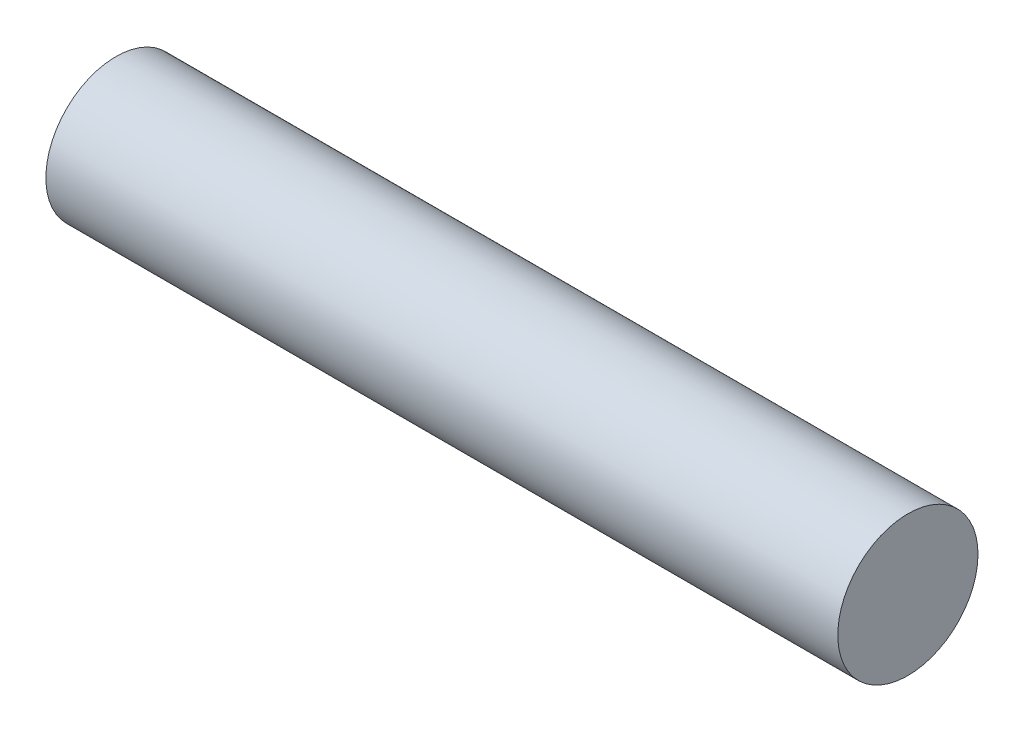
ISO-10303-21;
HEADER;
FILE_DESCRIPTION(('STEP AP214'),'2;1');
FILE_NAME('part.step','',(''),(''),'','','');
FILE_SCHEMA(('AUTOMOTIVE_DESIGN { 1 0 10303 214 1 1 1 1 }'));
ENDSEC;
DATA;
#1=APPLICATION_CONTEXT('core data for automotive mechanical design processes');
#2=APPLICATION_PROTOCOL_DEFINITION('international standard','automotive_design',2000,#1);
#3=PRODUCT_CONTEXT('',#1,'mechanical');
#4=PRODUCT('Part','Part','',(#3));
#5=PRODUCT_RELATED_PRODUCT_CATEGORY('part','',(#4));
#6=PRODUCT_DEFINITION_FORMATION('','',#4);
#7=PRODUCT_DEFINITION_CONTEXT('part definition',#1,'design');
#8=PRODUCT_DEFINITION('design','',#6,#7);
#9=PRODUCT_DEFINITION_SHAPE('','',#8);
#10=(LENGTH_UNIT() NAMED_UNIT(*) SI_UNIT(.MILLI.,.METRE.));
#11=(NAMED_UNIT(*) PLANE_ANGLE_UNIT() SI_UNIT($,.RADIAN.));
#12=(NAMED_UNIT(*) SI_UNIT($,.STERADIAN.) SOLID_ANGLE_UNIT());
#13=UNCERTAINTY_MEASURE_WITH_UNIT(LENGTH_MEASURE(1.E-05),#10,'distance_accuracy_value','');
#14=(GEOMETRIC_REPRESENTATION_CONTEXT(3) GLOBAL_UNCERTAINTY_ASSIGNED_CONTEXT((#13)) GLOBAL_UNIT_ASSIGNED_CONTEXT((#10,
#11,#12)) REPRESENTATION_CONTEXT('',''));
#15=CARTESIAN_POINT('',(0.,0.,0.));
#16=DIRECTION('',(0.,0.,1.));
#17=DIRECTION('',(1.,0.,0.));
#18=AXIS2_PLACEMENT_3D('',#15,#16,#17);
#19=CARTESIAN_POINT('',(141.2,0.,0.));
#20=DIRECTION('',(-1.,0.,0.));
#21=DIRECTION('',(0.,0.,1.));
#22=AXIS2_PLACEMENT_3D('',#19,#20,#21);
#23=CYLINDRICAL_SURFACE('',#22,12.5);
#24=CARTESIAN_POINT('',(141.2,0.,0.));
#25=DIRECTION('',(1.,0.,0.));
#26=DIRECTION('',(0.,0.,-1.));
#27=AXIS2_PLACEMENT_3D('',#24,#25,#26);
#28=CIRCLE('',#27,12.5);
#29=CARTESIAN_POINT('',(141.2,0.,-12.5));
#30=VERTEX_POINT('',#29);
#31=EDGE_CURVE('E10',#30,#30,#28,.T.);
#32=ORIENTED_EDGE('',*,*,#31,.F.);
#33=EDGE_LOOP('',(#32));
#34=FACE_BOUND('',#33,.T.);
#35=CARTESIAN_POINT('',(0.,0.,0.));
#36=DIRECTION('',(1.,0.,0.));
#37=DIRECTION('',(0.,0.,-1.));
#38=AXIS2_PLACEMENT_3D('',#35,#36,#37);
#39=CIRCLE('',#38,12.5);
#40=CARTESIAN_POINT('',(0.,0.,-12.5));
#41=VERTEX_POINT('',#40);
#42=EDGE_CURVE('E37',#41,#41,#39,.T.);
#43=ORIENTED_EDGE('',*,*,#42,.T.);
#44=EDGE_LOOP('',(#43));
#45=FACE_BOUND('',#44,.T.);
#46=ADVANCED_FACE('F40',(#34,#45),#23,.T.);
#47=CARTESIAN_POINT('',(141.2,0.,0.));
#48=DIRECTION('',(1.,0.,0.));
#49=DIRECTION('',(0.,0.,-1.));
#50=AXIS2_PLACEMENT_3D('',#47,#48,#49);
#51=PLANE('',#50);
#52=ORIENTED_EDGE('',*,*,#31,.T.);
#53=EDGE_LOOP('',(#52));
#54=FACE_BOUND('',#53,.T.);
#55=ADVANCED_FACE('F55',(#54),#51,.T.);
#56=CARTESIAN_POINT('',(0.,0.,0.));
#57=DIRECTION('',(1.,0.,0.));
#58=DIRECTION('',(0.,0.,-1.));
#59=AXIS2_PLACEMENT_3D('',#56,#57,#58);
#60=PLANE('',#59);
#61=ORIENTED_EDGE('',*,*,#42,.F.);
#62=EDGE_LOOP('',(#61));
#63=FACE_BOUND('',#62,.T.);
#64=ADVANCED_FACE('F49',(#63),#60,.F.);
#65=CLOSED_SHELL('',(#46,#55,#64));
#66=MANIFOLD_SOLID_BREP('B2',#65);
#67=ADVANCED_BREP_SHAPE_REPRESENTATION('',(#18,#66),#14);
#68=SHAPE_DEFINITION_REPRESENTATION(#9,#67);
ENDSEC;
END-ISO-10303-21;
